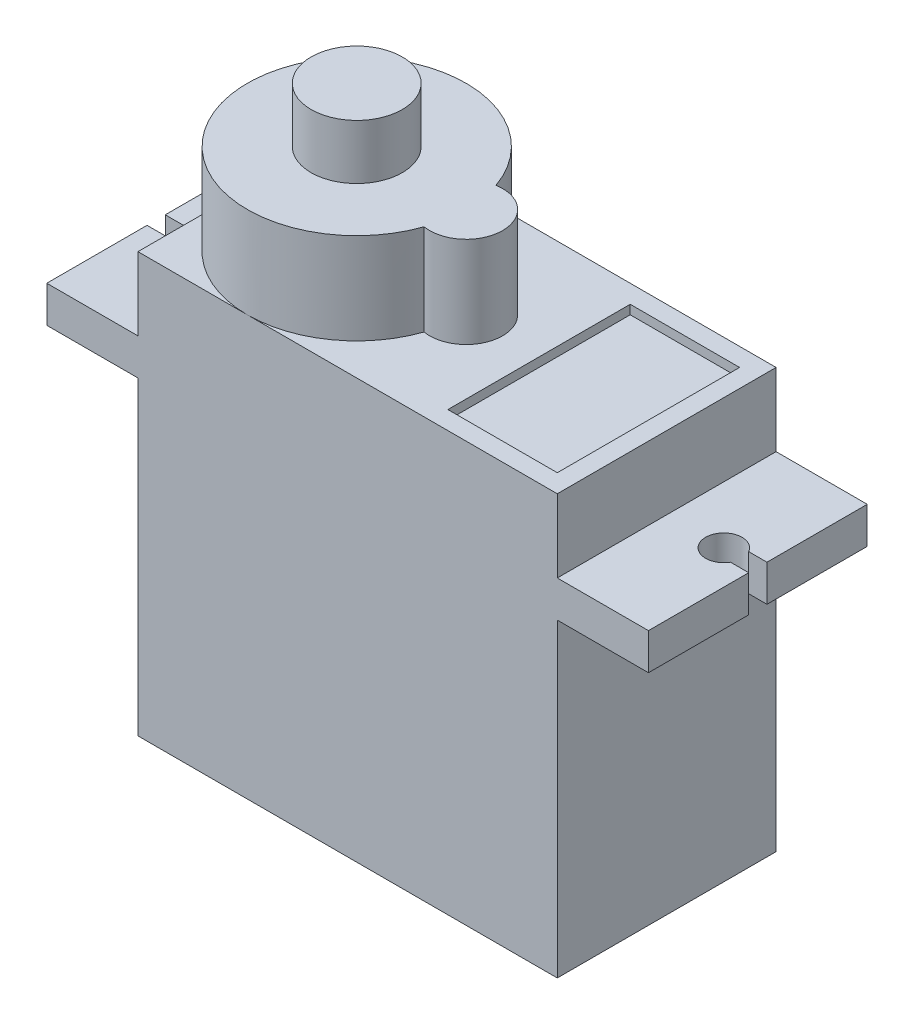
ISO-10303-21;
HEADER;
FILE_DESCRIPTION(('STEP AP214'),'2;1');
FILE_NAME('part.step','',(''),(''),'','','');
FILE_SCHEMA(('AUTOMOTIVE_DESIGN { 1 0 10303 214 1 1 1 1 }'));
ENDSEC;
DATA;
#1=APPLICATION_CONTEXT('core data for automotive mechanical design processes');
#2=APPLICATION_PROTOCOL_DEFINITION('international standard','automotive_design',2000,#1);
#3=PRODUCT_CONTEXT('',#1,'mechanical');
#4=PRODUCT('Part','Part','',(#3));
#5=PRODUCT_RELATED_PRODUCT_CATEGORY('part','',(#4));
#6=PRODUCT_DEFINITION_FORMATION('','',#4);
#7=PRODUCT_DEFINITION_CONTEXT('part definition',#1,'design');
#8=PRODUCT_DEFINITION('design','',#6,#7);
#9=PRODUCT_DEFINITION_SHAPE('','',#8);
#10=(LENGTH_UNIT() NAMED_UNIT(*) SI_UNIT(.MILLI.,.METRE.));
#11=(NAMED_UNIT(*) PLANE_ANGLE_UNIT() SI_UNIT($,.RADIAN.));
#12=(NAMED_UNIT(*) SI_UNIT($,.STERADIAN.) SOLID_ANGLE_UNIT());
#13=UNCERTAINTY_MEASURE_WITH_UNIT(LENGTH_MEASURE(1.E-05),#10,'distance_accuracy_value','');
#14=(GEOMETRIC_REPRESENTATION_CONTEXT(3) GLOBAL_UNCERTAINTY_ASSIGNED_CONTEXT((#13)) GLOBAL_UNIT_ASSIGNED_CONTEXT((#10,
#11,#12)) REPRESENTATION_CONTEXT('',''));
#15=CARTESIAN_POINT('',(0.,0.,0.));
#16=DIRECTION('',(0.,0.,1.));
#17=DIRECTION('',(1.,0.,0.));
#18=AXIS2_PLACEMENT_3D('',#15,#16,#17);
#19=CARTESIAN_POINT('',(-5.,0.,0.));
#20=DIRECTION('',(-1.,0.,0.));
#21=DIRECTION('',(0.,0.,-1.));
#22=AXIS2_PLACEMENT_3D('',#19,#20,#21);
#23=PLANE('',#22);
#24=DIRECTION('',(0.,1.,0.));
#25=VECTOR('',#24,1.);
#26=CARTESIAN_POINT('',(-5.,0.,-5.5));
#27=LINE('',#26,#25);
#28=CARTESIAN_POINT('',(-5.,17.,-5.5));
#29=VERTEX_POINT('',#28);
#30=CARTESIAN_POINT('',(-5.,19.,-5.5));
#31=VERTEX_POINT('',#30);
#32=EDGE_CURVE('E46',#29,#31,#27,.T.);
#33=ORIENTED_EDGE('',*,*,#32,.F.);
#34=DIRECTION('',(0.,0.,-1.));
#35=VECTOR('',#34,1.);
#36=CARTESIAN_POINT('',(-5.,17.,0.));
#37=LINE('',#36,#35);
#38=CARTESIAN_POINT('',(-5.,17.,0.));
#39=VERTEX_POINT('',#38);
#40=EDGE_CURVE('E346',#39,#29,#37,.T.);
#41=ORIENTED_EDGE('',*,*,#40,.F.);
#42=DIRECTION('',(0.,-1.,0.));
#43=VECTOR('',#42,1.);
#44=CARTESIAN_POINT('',(-5.,19.,0.));
#45=LINE('',#44,#43);
#46=CARTESIAN_POINT('',(-5.,19.,0.));
#47=VERTEX_POINT('',#46);
#48=EDGE_CURVE('E334',#47,#39,#45,.T.);
#49=ORIENTED_EDGE('',*,*,#48,.F.);
#50=DIRECTION('',(0.,0.,1.));
#51=VECTOR('',#50,1.);
#52=CARTESIAN_POINT('',(-5.,19.,0.));
#53=LINE('',#52,#51);
#54=EDGE_CURVE('E337',#31,#47,#53,.T.);
#55=ORIENTED_EDGE('',*,*,#54,.F.);
#56=EDGE_LOOP('',(#33,#41,#49,#55));
#57=FACE_BOUND('',#56,.T.);
#58=ADVANCED_FACE('F38',(#57),#23,.T.);
#59=CARTESIAN_POINT('',(0.,23.,0.));
#60=DIRECTION('',(1.,0.,0.));
#61=DIRECTION('',(0.,0.,-1.));
#62=AXIS2_PLACEMENT_3D('',#59,#60,#61);
#63=PLANE('',#62);
#64=DIRECTION('',(0.,-1.,0.));
#65=VECTOR('',#64,1.);
#66=CARTESIAN_POINT('',(0.,23.,-12.));
#67=LINE('',#66,#65);
#68=CARTESIAN_POINT('',(0.,23.,-12.));
#69=VERTEX_POINT('',#68);
#70=CARTESIAN_POINT('',(0.,19.,-12.));
#71=VERTEX_POINT('',#70);
#72=EDGE_CURVE('E457',#69,#71,#67,.T.);
#73=ORIENTED_EDGE('',*,*,#72,.T.);
#74=DIRECTION('',(0.,0.,1.));
#75=VECTOR('',#74,1.);
#76=CARTESIAN_POINT('',(0.,19.,0.));
#77=LINE('',#76,#75);
#78=CARTESIAN_POINT('',(0.,19.,0.));
#79=VERTEX_POINT('',#78);
#80=EDGE_CURVE('E333',#71,#79,#77,.T.);
#81=ORIENTED_EDGE('',*,*,#80,.T.);
#82=DIRECTION('',(0.,-1.,0.));
#83=VECTOR('',#82,1.);
#84=CARTESIAN_POINT('',(0.,23.,0.));
#85=LINE('',#84,#83);
#86=CARTESIAN_POINT('',(0.,23.,0.));
#87=VERTEX_POINT('',#86);
#88=EDGE_CURVE('E467',#87,#79,#85,.T.);
#89=ORIENTED_EDGE('',*,*,#88,.F.);
#90=DIRECTION('',(0.,0.,1.));
#91=VECTOR('',#90,1.);
#92=CARTESIAN_POINT('',(0.,23.,0.));
#93=LINE('',#92,#91);
#94=CARTESIAN_POINT('',(0.,23.,-6.));
#95=VERTEX_POINT('',#94);
#96=EDGE_CURVE('E435',#95,#87,#93,.T.);
#97=ORIENTED_EDGE('',*,*,#96,.F.);
#98=EDGE_CURVE('E431',#69,#95,#93,.T.);
#99=ORIENTED_EDGE('',*,*,#98,.F.);
#100=EDGE_LOOP('',(#73,#81,#89,#97,#99));
#101=FACE_BOUND('',#100,.T.);
#102=ADVANCED_FACE('F502',(#101),#63,.F.);
#103=CARTESIAN_POINT('',(28.,17.,0.));
#104=DIRECTION('',(0.,1.,0.));
#105=DIRECTION('',(0.,0.,1.));
#106=AXIS2_PLACEMENT_3D('',#103,#104,#105);
#107=PLANE('',#106);
#108=DIRECTION('',(1.,0.,0.));
#109=VECTOR('',#108,1.);
#110=CARTESIAN_POINT('',(28.,17.,-6.5));
#111=LINE('',#110,#109);
#112=CARTESIAN_POINT('',(27.,17.,-6.5));
#113=VERTEX_POINT('',#112);
#114=CARTESIAN_POINT('',(28.,17.,-6.5));
#115=VERTEX_POINT('',#114);
#116=EDGE_CURVE('E376',#113,#115,#111,.T.);
#117=ORIENTED_EDGE('',*,*,#116,.F.);
#118=CARTESIAN_POINT('',(26.1339745962156,17.,-6.));
#119=DIRECTION('',(0.,1.,0.));
#120=DIRECTION('',(0.,0.,1.));
#121=AXIS2_PLACEMENT_3D('',#118,#119,#120);
#122=CIRCLE('',#121,1.);
#123=CARTESIAN_POINT('',(27.,17.,-5.5));
#124=VERTEX_POINT('',#123);
#125=EDGE_CURVE('E378',#124,#113,#122,.F.);
#126=ORIENTED_EDGE('',*,*,#125,.F.);
#127=DIRECTION('',(-1.,0.,0.));
#128=VECTOR('',#127,1.);
#129=CARTESIAN_POINT('',(28.,17.,-5.5));
#130=LINE('',#129,#128);
#131=CARTESIAN_POINT('',(28.,17.,-5.5));
#132=VERTEX_POINT('',#131);
#133=EDGE_CURVE('E372',#132,#124,#130,.T.);
#134=ORIENTED_EDGE('',*,*,#133,.F.);
#135=DIRECTION('',(0.,0.,-1.));
#136=VECTOR('',#135,1.);
#137=CARTESIAN_POINT('',(28.,17.,0.));
#138=LINE('',#137,#136);
#139=CARTESIAN_POINT('',(28.,17.,0.));
#140=VERTEX_POINT('',#139);
#141=EDGE_CURVE('E386',#140,#132,#138,.T.);
#142=ORIENTED_EDGE('',*,*,#141,.F.);
#143=DIRECTION('',(-1.,0.,0.));
#144=VECTOR('',#143,1.);
#145=CARTESIAN_POINT('',(28.,17.,0.));
#146=LINE('',#145,#144);
#147=CARTESIAN_POINT('',(23.,17.,0.));
#148=VERTEX_POINT('',#147);
#149=EDGE_CURVE('E408',#140,#148,#146,.T.);
#150=ORIENTED_EDGE('',*,*,#149,.T.);
#151=DIRECTION('',(0.,0.,-1.));
#152=VECTOR('',#151,1.);
#153=CARTESIAN_POINT('',(23.,17.,0.));
#154=LINE('',#153,#152);
#155=CARTESIAN_POINT('',(23.,17.,-12.));
#156=VERTEX_POINT('',#155);
#157=EDGE_CURVE('E380',#148,#156,#154,.T.);
#158=ORIENTED_EDGE('',*,*,#157,.T.);
#159=DIRECTION('',(-1.,0.,0.));
#160=VECTOR('',#159,1.);
#161=CARTESIAN_POINT('',(28.,17.,-12.));
#162=LINE('',#161,#160);
#163=CARTESIAN_POINT('',(28.,17.,-12.));
#164=VERTEX_POINT('',#163);
#165=EDGE_CURVE('E405',#164,#156,#162,.T.);
#166=ORIENTED_EDGE('',*,*,#165,.F.);
#167=EDGE_CURVE('E384',#115,#164,#138,.T.);
#168=ORIENTED_EDGE('',*,*,#167,.F.);
#169=EDGE_LOOP('',(#117,#126,#134,#142,#150,#158,#166,#168));
#170=FACE_BOUND('',#169,.T.);
#171=ADVANCED_FACE('F538',(#170),#107,.F.);
#172=CARTESIAN_POINT('',(28.,19.,0.));
#173=DIRECTION('',(0.,-1.,0.));
#174=DIRECTION('',(0.,0.,-1.));
#175=AXIS2_PLACEMENT_3D('',#172,#173,#174);
#176=PLANE('',#175);
#177=DIRECTION('',(-1.,0.,0.));
#178=VECTOR('',#177,1.);
#179=CARTESIAN_POINT('',(28.,19.,-6.5));
#180=LINE('',#179,#178);
#181=CARTESIAN_POINT('',(28.,19.,-6.5));
#182=VERTEX_POINT('',#181);
#183=CARTESIAN_POINT('',(27.,19.,-6.5));
#184=VERTEX_POINT('',#183);
#185=EDGE_CURVE('E374',#182,#184,#180,.T.);
#186=ORIENTED_EDGE('',*,*,#185,.F.);
#187=DIRECTION('',(0.,0.,1.));
#188=VECTOR('',#187,1.);
#189=CARTESIAN_POINT('',(28.,19.,0.));
#190=LINE('',#189,#188);
#191=CARTESIAN_POINT('',(28.,19.,-12.));
#192=VERTEX_POINT('',#191);
#193=EDGE_CURVE('E392',#192,#182,#190,.T.);
#194=ORIENTED_EDGE('',*,*,#193,.F.);
#195=DIRECTION('',(-1.,0.,0.));
#196=VECTOR('',#195,1.);
#197=CARTESIAN_POINT('',(28.,19.,-12.));
#198=LINE('',#197,#196);
#199=CARTESIAN_POINT('',(23.,19.,-12.));
#200=VERTEX_POINT('',#199);
#201=EDGE_CURVE('E402',#192,#200,#198,.T.);
#202=ORIENTED_EDGE('',*,*,#201,.T.);
#203=DIRECTION('',(0.,0.,1.));
#204=VECTOR('',#203,1.);
#205=CARTESIAN_POINT('',(23.,19.,0.));
#206=LINE('',#205,#204);
#207=CARTESIAN_POINT('',(23.,19.,0.));
#208=VERTEX_POINT('',#207);
#209=EDGE_CURVE('E385',#200,#208,#206,.T.);
#210=ORIENTED_EDGE('',*,*,#209,.T.);
#211=DIRECTION('',(-1.,0.,0.));
#212=VECTOR('',#211,1.);
#213=CARTESIAN_POINT('',(28.,19.,0.));
#214=LINE('',#213,#212);
#215=CARTESIAN_POINT('',(28.,19.,0.));
#216=VERTEX_POINT('',#215);
#217=EDGE_CURVE('E395',#216,#208,#214,.T.);
#218=ORIENTED_EDGE('',*,*,#217,.F.);
#219=CARTESIAN_POINT('',(28.,19.,-5.5));
#220=VERTEX_POINT('',#219);
#221=EDGE_CURVE('E391',#220,#216,#190,.T.);
#222=ORIENTED_EDGE('',*,*,#221,.F.);
#223=DIRECTION('',(1.,0.,0.));
#224=VECTOR('',#223,1.);
#225=CARTESIAN_POINT('',(28.,19.,-5.5));
#226=LINE('',#225,#224);
#227=CARTESIAN_POINT('',(27.,19.,-5.5));
#228=VERTEX_POINT('',#227);
#229=EDGE_CURVE('E370',#228,#220,#226,.T.);
#230=ORIENTED_EDGE('',*,*,#229,.F.);
#231=CARTESIAN_POINT('',(26.1339745962156,19.,-6.));
#232=DIRECTION('',(0.,-1.,0.));
#233=DIRECTION('',(0.,0.,-1.));
#234=AXIS2_PLACEMENT_3D('',#231,#232,#233);
#235=CIRCLE('',#234,1.);
#236=EDGE_CURVE('E476',#184,#228,#235,.F.);
#237=ORIENTED_EDGE('',*,*,#236,.F.);
#238=EDGE_LOOP('',(#186,#194,#202,#210,#218,#222,#230,#237));
#239=FACE_BOUND('',#238,.T.);
#240=ADVANCED_FACE('F551',(#239),#176,.F.);
#241=CARTESIAN_POINT('',(28.,0.,0.));
#242=DIRECTION('',(1.,0.,0.));
#243=DIRECTION('',(0.,0.,-1.));
#244=AXIS2_PLACEMENT_3D('',#241,#242,#243);
#245=PLANE('',#244);
#246=ORIENTED_EDGE('',*,*,#193,.T.);
#247=DIRECTION('',(0.,-1.,0.));
#248=VECTOR('',#247,1.);
#249=CARTESIAN_POINT('',(28.,0.,-6.5));
#250=LINE('',#249,#248);
#251=EDGE_CURVE('E473',#182,#115,#250,.T.);
#252=ORIENTED_EDGE('',*,*,#251,.T.);
#253=ORIENTED_EDGE('',*,*,#167,.T.);
#254=DIRECTION('',(0.,1.,0.));
#255=VECTOR('',#254,1.);
#256=CARTESIAN_POINT('',(28.,19.,-12.));
#257=LINE('',#256,#255);
#258=EDGE_CURVE('E389',#164,#192,#257,.T.);
#259=ORIENTED_EDGE('',*,*,#258,.T.);
#260=EDGE_LOOP('',(#246,#252,#253,#259));
#261=FACE_BOUND('',#260,.T.);
#262=ADVANCED_FACE('F618',(#261),#245,.T.);
#263=ORIENTED_EDGE('',*,*,#141,.T.);
#264=DIRECTION('',(0.,1.,0.));
#265=VECTOR('',#264,1.);
#266=CARTESIAN_POINT('',(28.,0.,-5.5));
#267=LINE('',#266,#265);
#268=EDGE_CURVE('E470',#132,#220,#267,.T.);
#269=ORIENTED_EDGE('',*,*,#268,.T.);
#270=ORIENTED_EDGE('',*,*,#221,.T.);
#271=DIRECTION('',(0.,-1.,0.));
#272=VECTOR('',#271,1.);
#273=CARTESIAN_POINT('',(28.,19.,0.));
#274=LINE('',#273,#272);
#275=EDGE_CURVE('E381',#216,#140,#274,.T.);
#276=ORIENTED_EDGE('',*,*,#275,.T.);
#277=EDGE_LOOP('',(#263,#269,#270,#276));
#278=FACE_BOUND('',#277,.T.);
#279=ADVANCED_FACE('F543',(#278),#245,.T.);
#280=CARTESIAN_POINT('',(23.,23.,0.));
#281=DIRECTION('',(-1.,0.,0.));
#282=DIRECTION('',(0.,0.,1.));
#283=AXIS2_PLACEMENT_3D('',#280,#281,#282);
#284=PLANE('',#283);
#285=ORIENTED_EDGE('',*,*,#209,.F.);
#286=DIRECTION('',(0.,-1.,0.));
#287=VECTOR('',#286,1.);
#288=CARTESIAN_POINT('',(23.,23.,-12.));
#289=LINE('',#288,#287);
#290=CARTESIAN_POINT('',(23.,23.,-12.));
#291=VERTEX_POINT('',#290);
#292=EDGE_CURVE('E460',#291,#200,#289,.T.);
#293=ORIENTED_EDGE('',*,*,#292,.F.);
#294=DIRECTION('',(0.,0.,-1.));
#295=VECTOR('',#294,1.);
#296=CARTESIAN_POINT('',(23.,23.,0.));
#297=LINE('',#296,#295);
#298=CARTESIAN_POINT('',(23.,23.,0.));
#299=VERTEX_POINT('',#298);
#300=EDGE_CURVE('E439',#299,#291,#297,.T.);
#301=ORIENTED_EDGE('',*,*,#300,.F.);
#302=DIRECTION('',(0.,-1.,0.));
#303=VECTOR('',#302,1.);
#304=CARTESIAN_POINT('',(23.,23.,0.));
#305=LINE('',#304,#303);
#306=EDGE_CURVE('E464',#299,#208,#305,.T.);
#307=ORIENTED_EDGE('',*,*,#306,.T.);
#308=EDGE_LOOP('',(#285,#293,#301,#307));
#309=FACE_BOUND('',#308,.T.);
#310=ADVANCED_FACE('F557',(#309),#284,.F.);
#311=ORIENTED_EDGE('',*,*,#157,.F.);
#312=CARTESIAN_POINT('',(23.,0.,0.));
#313=VERTEX_POINT('',#312);
#314=EDGE_CURVE('E463',#148,#313,#305,.T.);
#315=ORIENTED_EDGE('',*,*,#314,.T.);
#316=DIRECTION('',(0.,0.,-1.));
#317=VECTOR('',#316,1.);
#318=CARTESIAN_POINT('',(23.,0.,0.));
#319=LINE('',#318,#317);
#320=CARTESIAN_POINT('',(23.,0.,-12.));
#321=VERTEX_POINT('',#320);
#322=EDGE_CURVE('E451',#313,#321,#319,.T.);
#323=ORIENTED_EDGE('',*,*,#322,.T.);
#324=EDGE_CURVE('E459',#156,#321,#289,.T.);
#325=ORIENTED_EDGE('',*,*,#324,.F.);
#326=EDGE_LOOP('',(#311,#315,#323,#325));
#327=FACE_BOUND('',#326,.T.);
#328=ADVANCED_FACE('F533',(#327),#284,.F.);
#329=CARTESIAN_POINT('',(0.,23.,0.));
#330=DIRECTION('',(0.,-1.,0.));
#331=DIRECTION('',(0.,0.,-1.));
#332=AXIS2_PLACEMENT_3D('',#329,#330,#331);
#333=PLANE('',#332);
#334=DIRECTION('',(1.,0.,0.));
#335=VECTOR('',#334,1.);
#336=CARTESIAN_POINT('',(16.,23.,-1.));
#337=LINE('',#336,#335);
#338=CARTESIAN_POINT('',(16.,23.,-1.));
#339=VERTEX_POINT('',#338);
#340=CARTESIAN_POINT('',(22.,23.,-1.));
#341=VERTEX_POINT('',#340);
#342=EDGE_CURVE('E296',#339,#341,#337,.T.);
#343=ORIENTED_EDGE('',*,*,#342,.F.);
#344=DIRECTION('',(0.,0.,1.));
#345=VECTOR('',#344,1.);
#346=CARTESIAN_POINT('',(16.,23.,-11.));
#347=LINE('',#346,#345);
#348=CARTESIAN_POINT('',(16.,23.,-11.));
#349=VERTEX_POINT('',#348);
#350=EDGE_CURVE('E61',#349,#339,#347,.T.);
#351=ORIENTED_EDGE('',*,*,#350,.F.);
#352=DIRECTION('',(-1.,0.,0.));
#353=VECTOR('',#352,1.);
#354=CARTESIAN_POINT('',(16.,23.,-11.));
#355=LINE('',#354,#353);
#356=CARTESIAN_POINT('',(22.,23.,-11.));
#357=VERTEX_POINT('',#356);
#358=EDGE_CURVE('E285',#357,#349,#355,.T.);
#359=ORIENTED_EDGE('',*,*,#358,.F.);
#360=DIRECTION('',(0.,0.,-1.));
#361=VECTOR('',#360,1.);
#362=CARTESIAN_POINT('',(22.,23.,-11.));
#363=LINE('',#362,#361);
#364=EDGE_CURVE('E299',#341,#357,#363,.T.);
#365=ORIENTED_EDGE('',*,*,#364,.F.);
#366=EDGE_LOOP('',(#343,#351,#359,#365));
#367=FACE_BOUND('',#366,.T.);
#368=CARTESIAN_POINT('',(12.,23.,-6.));
#369=DIRECTION('',(0.,1.,0.));
#370=DIRECTION('',(0.,0.,1.));
#371=AXIS2_PLACEMENT_3D('',#368,#369,#370);
#372=CIRCLE('',#371,2.);
#373=CARTESIAN_POINT('',(11.6666666666667,23.,-4.02797340563346));
#374=VERTEX_POINT('',#373);
#375=CARTESIAN_POINT('',(11.6666666666667,23.,-7.97202659436654));
#376=VERTEX_POINT('',#375);
#377=EDGE_CURVE('E411',#374,#376,#372,.T.);
#378=ORIENTED_EDGE('',*,*,#377,.F.);
#379=CARTESIAN_POINT('',(6.,23.,-6.));
#380=DIRECTION('',(0.,1.,0.));
#381=DIRECTION('',(0.,0.,1.));
#382=AXIS2_PLACEMENT_3D('',#379,#380,#381);
#383=CIRCLE('',#382,6.);
#384=CARTESIAN_POINT('',(6.,23.,0.));
#385=VERTEX_POINT('',#384);
#386=EDGE_CURVE('E424',#385,#374,#383,.T.);
#387=ORIENTED_EDGE('',*,*,#386,.F.);
#388=DIRECTION('',(1.,0.,0.));
#389=VECTOR('',#388,1.);
#390=CARTESIAN_POINT('',(0.,23.,0.));
#391=LINE('',#390,#389);
#392=EDGE_CURVE('E434',#385,#299,#391,.T.);
#393=ORIENTED_EDGE('',*,*,#392,.T.);
#394=ORIENTED_EDGE('',*,*,#300,.T.);
#395=DIRECTION('',(-1.,0.,0.));
#396=VECTOR('',#395,1.);
#397=CARTESIAN_POINT('',(0.,23.,-12.));
#398=LINE('',#397,#396);
#399=CARTESIAN_POINT('',(6.,23.,-12.));
#400=VERTEX_POINT('',#399);
#401=EDGE_CURVE('E442',#291,#400,#398,.T.);
#402=ORIENTED_EDGE('',*,*,#401,.T.);
#403=EDGE_CURVE('E416',#376,#400,#383,.T.);
#404=ORIENTED_EDGE('',*,*,#403,.F.);
#405=EDGE_LOOP('',(#378,#387,#393,#394,#402,#404));
#406=FACE_BOUND('',#405,.T.);
#407=ADVANCED_FACE('F561',(#367,#406),#333,.F.);
#408=EDGE_CURVE('E423',#400,#95,#383,.T.);
#409=ORIENTED_EDGE('',*,*,#408,.F.);
#410=EDGE_CURVE('E441',#400,#69,#398,.T.);
#411=ORIENTED_EDGE('',*,*,#410,.T.);
#412=ORIENTED_EDGE('',*,*,#98,.T.);
#413=EDGE_LOOP('',(#409,#411,#412));
#414=FACE_BOUND('',#413,.T.);
#415=ADVANCED_FACE('F576',(#414),#333,.F.);
#416=DIRECTION('',(0.,0.,1.));
#417=VECTOR('',#416,1.);
#418=CARTESIAN_POINT('',(0.,5.,-7.5));
#419=LINE('',#418,#417);
#420=CARTESIAN_POINT('',(0.,5.,-7.5));
#421=VERTEX_POINT('',#420);
#422=CARTESIAN_POINT('',(0.,5.,-4.5));
#423=VERTEX_POINT('',#422);
#424=EDGE_CURVE('E272',#421,#423,#419,.T.);
#425=ORIENTED_EDGE('',*,*,#424,.F.);
#426=DIRECTION('',(0.,-1.,0.));
#427=VECTOR('',#426,1.);
#428=CARTESIAN_POINT('',(0.,6.,-7.5));
#429=LINE('',#428,#427);
#430=CARTESIAN_POINT('',(0.,6.,-7.5));
#431=VERTEX_POINT('',#430);
#432=EDGE_CURVE('E53',#431,#421,#429,.T.);
#433=ORIENTED_EDGE('',*,*,#432,.F.);
#434=DIRECTION('',(0.,0.,-1.));
#435=VECTOR('',#434,1.);
#436=CARTESIAN_POINT('',(0.,6.,-7.5));
#437=LINE('',#436,#435);
#438=CARTESIAN_POINT('',(0.,6.,-4.5));
#439=VERTEX_POINT('',#438);
#440=EDGE_CURVE('E263',#439,#431,#437,.T.);
#441=ORIENTED_EDGE('',*,*,#440,.F.);
#442=DIRECTION('',(0.,1.,0.));
#443=VECTOR('',#442,1.);
#444=CARTESIAN_POINT('',(0.,6.,-4.5));
#445=LINE('',#444,#443);
#446=EDGE_CURVE('E266',#423,#439,#445,.T.);
#447=ORIENTED_EDGE('',*,*,#446,.F.);
#448=EDGE_LOOP('',(#425,#433,#441,#447));
#449=FACE_BOUND('',#448,.T.);
#450=CARTESIAN_POINT('',(0.,17.,0.));
#451=VERTEX_POINT('',#450);
#452=CARTESIAN_POINT('',(0.,0.,0.));
#453=VERTEX_POINT('',#452);
#454=EDGE_CURVE('E466',#451,#453,#85,.T.);
#455=ORIENTED_EDGE('',*,*,#454,.F.);
#456=DIRECTION('',(0.,0.,-1.));
#457=VECTOR('',#456,1.);
#458=CARTESIAN_POINT('',(0.,17.,0.));
#459=LINE('',#458,#457);
#460=CARTESIAN_POINT('',(0.,17.,-12.));
#461=VERTEX_POINT('',#460);
#462=EDGE_CURVE('E338',#451,#461,#459,.T.);
#463=ORIENTED_EDGE('',*,*,#462,.T.);
#464=CARTESIAN_POINT('',(0.,0.,-12.));
#465=VERTEX_POINT('',#464);
#466=EDGE_CURVE('E445',#461,#465,#67,.T.);
#467=ORIENTED_EDGE('',*,*,#466,.T.);
#468=DIRECTION('',(0.,0.,1.));
#469=VECTOR('',#468,1.);
#470=CARTESIAN_POINT('',(0.,0.,0.));
#471=LINE('',#470,#469);
#472=EDGE_CURVE('E430',#465,#453,#471,.T.);
#473=ORIENTED_EDGE('',*,*,#472,.T.);
#474=EDGE_LOOP('',(#455,#463,#467,#473));
#475=FACE_BOUND('',#474,.T.);
#476=ADVANCED_FACE('F40',(#449,#475),#63,.F.);
#477=CARTESIAN_POINT('',(0.,23.,0.));
#478=DIRECTION('',(0.,0.,-1.));
#479=DIRECTION('',(-1.,0.,0.));
#480=AXIS2_PLACEMENT_3D('',#477,#478,#479);
#481=PLANE('',#480);
#482=DIRECTION('',(1.,0.,0.));
#483=VECTOR('',#482,1.);
#484=CARTESIAN_POINT('',(0.,0.,0.));
#485=LINE('',#484,#483);
#486=EDGE_CURVE('E448',#453,#313,#485,.T.);
#487=ORIENTED_EDGE('',*,*,#486,.T.);
#488=ORIENTED_EDGE('',*,*,#314,.F.);
#489=ORIENTED_EDGE('',*,*,#149,.F.);
#490=ORIENTED_EDGE('',*,*,#275,.F.);
#491=ORIENTED_EDGE('',*,*,#217,.T.);
#492=ORIENTED_EDGE('',*,*,#306,.F.);
#493=ORIENTED_EDGE('',*,*,#392,.F.);
#494=EDGE_CURVE('E436',#87,#385,#391,.T.);
#495=ORIENTED_EDGE('',*,*,#494,.F.);
#496=ORIENTED_EDGE('',*,*,#88,.T.);
#497=DIRECTION('',(1.,0.,0.));
#498=VECTOR('',#497,1.);
#499=CARTESIAN_POINT('',(-5.,19.,0.));
#500=LINE('',#499,#498);
#501=EDGE_CURVE('E361',#47,#79,#500,.T.);
#502=ORIENTED_EDGE('',*,*,#501,.F.);
#503=ORIENTED_EDGE('',*,*,#48,.T.);
#504=DIRECTION('',(1.,0.,0.));
#505=VECTOR('',#504,1.);
#506=CARTESIAN_POINT('',(-5.,17.,0.));
#507=LINE('',#506,#505);
#508=EDGE_CURVE('E349',#39,#451,#507,.T.);
#509=ORIENTED_EDGE('',*,*,#508,.T.);
#510=ORIENTED_EDGE('',*,*,#454,.T.);
#511=EDGE_LOOP('',(#487,#488,#489,#490,#491,#492,#493,#495,#496,#502,#503,#509,#510));
#512=FACE_BOUND('',#511,.T.);
#513=ADVANCED_FACE('F495',(#512),#481,.F.);
#514=CARTESIAN_POINT('',(0.,23.,-12.));
#515=DIRECTION('',(0.,0.,1.));
#516=DIRECTION('',(1.,0.,0.));
#517=AXIS2_PLACEMENT_3D('',#514,#515,#516);
#518=PLANE('',#517);
#519=DIRECTION('',(-1.,0.,0.));
#520=VECTOR('',#519,1.);
#521=CARTESIAN_POINT('',(0.,0.,-12.));
#522=LINE('',#521,#520);
#523=EDGE_CURVE('E454',#321,#465,#522,.T.);
#524=ORIENTED_EDGE('',*,*,#523,.T.);
#525=ORIENTED_EDGE('',*,*,#466,.F.);
#526=DIRECTION('',(1.,0.,0.));
#527=VECTOR('',#526,1.);
#528=CARTESIAN_POINT('',(-5.,17.,-12.));
#529=LINE('',#528,#527);
#530=CARTESIAN_POINT('',(-5.,17.,-12.));
#531=VERTEX_POINT('',#530);
#532=EDGE_CURVE('E355',#531,#461,#529,.T.);
#533=ORIENTED_EDGE('',*,*,#532,.F.);
#534=DIRECTION('',(0.,1.,0.));
#535=VECTOR('',#534,1.);
#536=CARTESIAN_POINT('',(-5.,19.,-12.));
#537=LINE('',#536,#535);
#538=CARTESIAN_POINT('',(-5.,19.,-12.));
#539=VERTEX_POINT('',#538);
#540=EDGE_CURVE('E342',#531,#539,#537,.T.);
#541=ORIENTED_EDGE('',*,*,#540,.T.);
#542=DIRECTION('',(1.,0.,0.));
#543=VECTOR('',#542,1.);
#544=CARTESIAN_POINT('',(-5.,19.,-12.));
#545=LINE('',#544,#543);
#546=EDGE_CURVE('E358',#539,#71,#545,.T.);
#547=ORIENTED_EDGE('',*,*,#546,.T.);
#548=ORIENTED_EDGE('',*,*,#72,.F.);
#549=ORIENTED_EDGE('',*,*,#410,.F.);
#550=ORIENTED_EDGE('',*,*,#401,.F.);
#551=ORIENTED_EDGE('',*,*,#292,.T.);
#552=ORIENTED_EDGE('',*,*,#201,.F.);
#553=ORIENTED_EDGE('',*,*,#258,.F.);
#554=ORIENTED_EDGE('',*,*,#165,.T.);
#555=ORIENTED_EDGE('',*,*,#324,.T.);
#556=EDGE_LOOP('',(#524,#525,#533,#541,#547,#548,#549,#550,#551,#552,#553,#554,#555));
#557=FACE_BOUND('',#556,.T.);
#558=ADVANCED_FACE('F508',(#557),#518,.F.);
#559=EDGE_CURVE('E572',#95,#385,#383,.T.);
#560=ORIENTED_EDGE('',*,*,#559,.F.);
#561=ORIENTED_EDGE('',*,*,#96,.T.);
#562=ORIENTED_EDGE('',*,*,#494,.T.);
#563=EDGE_LOOP('',(#560,#561,#562));
#564=FACE_BOUND('',#563,.T.);
#565=ADVANCED_FACE('F574',(#564),#333,.F.);
#566=CARTESIAN_POINT('',(0.,0.,0.));
#567=DIRECTION('',(0.,-1.,0.));
#568=DIRECTION('',(0.,0.,-1.));
#569=AXIS2_PLACEMENT_3D('',#566,#567,#568);
#570=PLANE('',#569);
#571=ORIENTED_EDGE('',*,*,#472,.F.);
#572=ORIENTED_EDGE('',*,*,#523,.F.);
#573=ORIENTED_EDGE('',*,*,#322,.F.);
#574=ORIENTED_EDGE('',*,*,#486,.F.);
#575=EDGE_LOOP('',(#571,#572,#573,#574));
#576=FACE_BOUND('',#575,.T.);
#577=ADVANCED_FACE('F530',(#576),#570,.T.);
#578=CARTESIAN_POINT('',(12.,28.,-6.));
#579=DIRECTION('',(0.,-1.,0.));
#580=DIRECTION('',(0.,0.,-1.));
#581=AXIS2_PLACEMENT_3D('',#578,#579,#580);
#582=CYLINDRICAL_SURFACE('',#581,2.);
#583=ORIENTED_EDGE('',*,*,#377,.T.);
#584=DIRECTION('',(0.,-1.,0.));
#585=VECTOR('',#584,1.);
#586=CARTESIAN_POINT('',(11.6666666666667,28.,-7.97202659436654));
#587=LINE('',#586,#585);
#588=CARTESIAN_POINT('',(11.6666666666667,28.,-7.97202659436654));
#589=VERTEX_POINT('',#588);
#590=EDGE_CURVE('E427',#589,#376,#587,.T.);
#591=ORIENTED_EDGE('',*,*,#590,.F.);
#592=CARTESIAN_POINT('',(12.,28.,-6.));
#593=DIRECTION('',(0.,1.,0.));
#594=DIRECTION('',(0.,0.,1.));
#595=AXIS2_PLACEMENT_3D('',#592,#593,#594);
#596=CIRCLE('',#595,2.);
#597=CARTESIAN_POINT('',(11.6666666666667,28.,-4.02797340563346));
#598=VERTEX_POINT('',#597);
#599=EDGE_CURVE('E412',#598,#589,#596,.T.);
#600=ORIENTED_EDGE('',*,*,#599,.F.);
#601=DIRECTION('',(0.,-1.,0.));
#602=VECTOR('',#601,1.);
#603=CARTESIAN_POINT('',(11.6666666666667,28.,-4.02797340563346));
#604=LINE('',#603,#602);
#605=EDGE_CURVE('E418',#598,#374,#604,.T.);
#606=ORIENTED_EDGE('',*,*,#605,.T.);
#607=EDGE_LOOP('',(#583,#591,#600,#606));
#608=FACE_BOUND('',#607,.T.);
#609=ADVANCED_FACE('F570',(#608),#582,.T.);
#610=CARTESIAN_POINT('',(6.,28.,-6.));
#611=DIRECTION('',(0.,-1.,0.));
#612=DIRECTION('',(0.,0.,-1.));
#613=AXIS2_PLACEMENT_3D('',#610,#611,#612);
#614=CYLINDRICAL_SURFACE('',#613,6.);
#615=ORIENTED_EDGE('',*,*,#403,.T.);
#616=ORIENTED_EDGE('',*,*,#408,.T.);
#617=ORIENTED_EDGE('',*,*,#559,.T.);
#618=ORIENTED_EDGE('',*,*,#386,.T.);
#619=ORIENTED_EDGE('',*,*,#605,.F.);
#620=CARTESIAN_POINT('',(6.,28.,-6.));
#621=DIRECTION('',(0.,1.,0.));
#622=DIRECTION('',(0.,0.,1.));
#623=AXIS2_PLACEMENT_3D('',#620,#621,#622);
#624=CIRCLE('',#623,6.);
#625=EDGE_CURVE('E415',#589,#598,#624,.T.);
#626=ORIENTED_EDGE('',*,*,#625,.F.);
#627=ORIENTED_EDGE('',*,*,#590,.T.);
#628=EDGE_LOOP('',(#615,#616,#617,#618,#619,#626,#627));
#629=FACE_BOUND('',#628,.T.);
#630=ADVANCED_FACE('F564',(#629),#614,.T.);
#631=CARTESIAN_POINT('',(9.,28.,-6.));
#632=DIRECTION('',(0.,1.,0.));
#633=DIRECTION('',(0.,0.,1.));
#634=AXIS2_PLACEMENT_3D('',#631,#632,#633);
#635=PLANE('',#634);
#636=CARTESIAN_POINT('',(6.,28.,-6.));
#637=DIRECTION('',(0.,1.,0.));
#638=DIRECTION('',(0.,0.,1.));
#639=AXIS2_PLACEMENT_3D('',#636,#637,#638);
#640=CIRCLE('',#639,2.5);
#641=CARTESIAN_POINT('',(6.,28.,-3.5));
#642=VERTEX_POINT('',#641);
#643=EDGE_CURVE('E306',#642,#642,#640,.T.);
#644=ORIENTED_EDGE('',*,*,#643,.F.);
#645=EDGE_LOOP('',(#644));
#646=FACE_BOUND('',#645,.T.);
#647=ORIENTED_EDGE('',*,*,#599,.T.);
#648=ORIENTED_EDGE('',*,*,#625,.T.);
#649=EDGE_LOOP('',(#647,#648));
#650=FACE_BOUND('',#649,.T.);
#651=ADVANCED_FACE('F613',(#646,#650),#635,.T.);
#652=CARTESIAN_POINT('',(26.1339745962156,28.,-6.));
#653=DIRECTION('',(0.,-1.,0.));
#654=DIRECTION('',(0.,0.,-1.));
#655=AXIS2_PLACEMENT_3D('',#652,#653,#654);
#656=CYLINDRICAL_SURFACE('',#655,1.);
#657=ORIENTED_EDGE('',*,*,#125,.T.);
#658=DIRECTION('',(0.,-1.,0.));
#659=VECTOR('',#658,1.);
#660=CARTESIAN_POINT('',(27.,28.,-6.5));
#661=LINE('',#660,#659);
#662=EDGE_CURVE('E367',#184,#113,#661,.T.);
#663=ORIENTED_EDGE('',*,*,#662,.F.);
#664=ORIENTED_EDGE('',*,*,#236,.T.);
#665=DIRECTION('',(0.,-1.,0.));
#666=VECTOR('',#665,1.);
#667=CARTESIAN_POINT('',(27.,28.,-5.5));
#668=LINE('',#667,#666);
#669=EDGE_CURVE('E364',#228,#124,#668,.T.);
#670=ORIENTED_EDGE('',*,*,#669,.T.);
#671=EDGE_LOOP('',(#657,#663,#664,#670));
#672=FACE_BOUND('',#671,.T.);
#673=ADVANCED_FACE('F610',(#672),#656,.F.);
#674=CARTESIAN_POINT('',(28.,28.,-6.5));
#675=DIRECTION('',(0.,0.,1.));
#676=DIRECTION('',(1.,0.,0.));
#677=AXIS2_PLACEMENT_3D('',#674,#675,#676);
#678=PLANE('',#677);
#679=ORIENTED_EDGE('',*,*,#116,.T.);
#680=ORIENTED_EDGE('',*,*,#251,.F.);
#681=ORIENTED_EDGE('',*,*,#185,.T.);
#682=ORIENTED_EDGE('',*,*,#662,.T.);
#683=EDGE_LOOP('',(#679,#680,#681,#682));
#684=FACE_BOUND('',#683,.T.);
#685=ADVANCED_FACE('F608',(#684),#678,.T.);
#686=CARTESIAN_POINT('',(28.,28.,-5.5));
#687=DIRECTION('',(0.,0.,-1.));
#688=DIRECTION('',(-1.,0.,0.));
#689=AXIS2_PLACEMENT_3D('',#686,#687,#688);
#690=PLANE('',#689);
#691=ORIENTED_EDGE('',*,*,#133,.T.);
#692=ORIENTED_EDGE('',*,*,#669,.F.);
#693=ORIENTED_EDGE('',*,*,#229,.T.);
#694=ORIENTED_EDGE('',*,*,#268,.F.);
#695=EDGE_LOOP('',(#691,#692,#693,#694));
#696=FACE_BOUND('',#695,.T.);
#697=ADVANCED_FACE('F603',(#696),#690,.T.);
#698=CARTESIAN_POINT('',(-5.,19.,0.));
#699=DIRECTION('',(0.,1.,0.));
#700=DIRECTION('',(0.,0.,1.));
#701=AXIS2_PLACEMENT_3D('',#698,#699,#700);
#702=PLANE('',#701);
#703=DIRECTION('',(1.,0.,0.));
#704=VECTOR('',#703,1.);
#705=CARTESIAN_POINT('',(-5.,19.,-5.5));
#706=LINE('',#705,#704);
#707=CARTESIAN_POINT('',(-4.,19.,-5.5));
#708=VERTEX_POINT('',#707);
#709=EDGE_CURVE('E329',#31,#708,#706,.T.);
#710=ORIENTED_EDGE('',*,*,#709,.F.);
#711=ORIENTED_EDGE('',*,*,#54,.T.);
#712=ORIENTED_EDGE('',*,*,#501,.T.);
#713=ORIENTED_EDGE('',*,*,#80,.F.);
#714=ORIENTED_EDGE('',*,*,#546,.F.);
#715=CARTESIAN_POINT('',(-5.,19.,-6.5));
#716=VERTEX_POINT('',#715);
#717=EDGE_CURVE('E339',#539,#716,#53,.T.);
#718=ORIENTED_EDGE('',*,*,#717,.T.);
#719=DIRECTION('',(-1.,0.,0.));
#720=VECTOR('',#719,1.);
#721=CARTESIAN_POINT('',(-5.,19.,-6.5));
#722=LINE('',#721,#720);
#723=CARTESIAN_POINT('',(-4.,19.,-6.5));
#724=VERTEX_POINT('',#723);
#725=EDGE_CURVE('E325',#724,#716,#722,.T.);
#726=ORIENTED_EDGE('',*,*,#725,.F.);
#727=CARTESIAN_POINT('',(-3.13397459621556,19.,-6.));
#728=DIRECTION('',(0.,1.,0.));
#729=DIRECTION('',(0.,0.,1.));
#730=AXIS2_PLACEMENT_3D('',#727,#728,#729);
#731=CIRCLE('',#730,1.);
#732=EDGE_CURVE('E331',#708,#724,#731,.T.);
#733=ORIENTED_EDGE('',*,*,#732,.F.);
#734=EDGE_LOOP('',(#710,#711,#712,#713,#714,#718,#726,#733));
#735=FACE_BOUND('',#734,.T.);
#736=ADVANCED_FACE('F490',(#735),#702,.T.);
#737=CARTESIAN_POINT('',(-5.,17.,0.));
#738=DIRECTION('',(0.,-1.,0.));
#739=DIRECTION('',(0.,0.,-1.));
#740=AXIS2_PLACEMENT_3D('',#737,#738,#739);
#741=PLANE('',#740);
#742=DIRECTION('',(-1.,0.,0.));
#743=VECTOR('',#742,1.);
#744=CARTESIAN_POINT('',(-5.,17.,-5.5));
#745=LINE('',#744,#743);
#746=CARTESIAN_POINT('',(-4.,17.,-5.5));
#747=VERTEX_POINT('',#746);
#748=EDGE_CURVE('E327',#747,#29,#745,.T.);
#749=ORIENTED_EDGE('',*,*,#748,.F.);
#750=CARTESIAN_POINT('',(-3.13397459621556,17.,-6.));
#751=DIRECTION('',(0.,-1.,0.));
#752=DIRECTION('',(0.,0.,-1.));
#753=AXIS2_PLACEMENT_3D('',#750,#751,#752);
#754=CIRCLE('',#753,1.);
#755=CARTESIAN_POINT('',(-4.,17.,-6.5));
#756=VERTEX_POINT('',#755);
#757=EDGE_CURVE('E11',#756,#747,#754,.T.);
#758=ORIENTED_EDGE('',*,*,#757,.F.);
#759=DIRECTION('',(1.,0.,0.));
#760=VECTOR('',#759,1.);
#761=CARTESIAN_POINT('',(-5.,17.,-6.5));
#762=LINE('',#761,#760);
#763=CARTESIAN_POINT('',(-5.,17.,-6.5));
#764=VERTEX_POINT('',#763);
#765=EDGE_CURVE('E323',#764,#756,#762,.T.);
#766=ORIENTED_EDGE('',*,*,#765,.F.);
#767=EDGE_CURVE('E345',#764,#531,#37,.T.);
#768=ORIENTED_EDGE('',*,*,#767,.T.);
#769=ORIENTED_EDGE('',*,*,#532,.T.);
#770=ORIENTED_EDGE('',*,*,#462,.F.);
#771=ORIENTED_EDGE('',*,*,#508,.F.);
#772=ORIENTED_EDGE('',*,*,#40,.T.);
#773=EDGE_LOOP('',(#749,#758,#766,#768,#769,#770,#771,#772));
#774=FACE_BOUND('',#773,.T.);
#775=ADVANCED_FACE('F523',(#774),#741,.T.);
#776=DIRECTION('',(0.,-1.,0.));
#777=VECTOR('',#776,1.);
#778=CARTESIAN_POINT('',(-5.,0.,-6.5));
#779=LINE('',#778,#777);
#780=EDGE_CURVE('E478',#716,#764,#779,.T.);
#781=ORIENTED_EDGE('',*,*,#780,.F.);
#782=ORIENTED_EDGE('',*,*,#717,.F.);
#783=ORIENTED_EDGE('',*,*,#540,.F.);
#784=ORIENTED_EDGE('',*,*,#767,.F.);
#785=EDGE_LOOP('',(#781,#782,#783,#784));
#786=FACE_BOUND('',#785,.T.);
#787=ADVANCED_FACE('F514',(#786),#23,.T.);
#788=CARTESIAN_POINT('',(-5.,28.,-5.5));
#789=DIRECTION('',(0.,0.,1.));
#790=DIRECTION('',(1.,0.,0.));
#791=AXIS2_PLACEMENT_3D('',#788,#789,#790);
#792=PLANE('',#791);
#793=ORIENTED_EDGE('',*,*,#709,.T.);
#794=DIRECTION('',(0.,-1.,0.));
#795=VECTOR('',#794,1.);
#796=CARTESIAN_POINT('',(-4.,28.,-5.5));
#797=LINE('',#796,#795);
#798=EDGE_CURVE('E320',#708,#747,#797,.T.);
#799=ORIENTED_EDGE('',*,*,#798,.T.);
#800=ORIENTED_EDGE('',*,*,#748,.T.);
#801=ORIENTED_EDGE('',*,*,#32,.T.);
#802=EDGE_LOOP('',(#793,#799,#800,#801));
#803=FACE_BOUND('',#802,.T.);
#804=ADVANCED_FACE('F482',(#803),#792,.F.);
#805=CARTESIAN_POINT('',(-3.13397459621556,28.,-6.));
#806=DIRECTION('',(0.,-1.,0.));
#807=DIRECTION('',(0.,0.,-1.));
#808=AXIS2_PLACEMENT_3D('',#805,#806,#807);
#809=CYLINDRICAL_SURFACE('',#808,1.);
#810=ORIENTED_EDGE('',*,*,#732,.T.);
#811=DIRECTION('',(0.,-1.,0.));
#812=VECTOR('',#811,1.);
#813=CARTESIAN_POINT('',(-4.,28.,-6.5));
#814=LINE('',#813,#812);
#815=EDGE_CURVE('E315',#724,#756,#814,.T.);
#816=ORIENTED_EDGE('',*,*,#815,.T.);
#817=ORIENTED_EDGE('',*,*,#757,.T.);
#818=ORIENTED_EDGE('',*,*,#798,.F.);
#819=EDGE_LOOP('',(#810,#816,#817,#818));
#820=FACE_BOUND('',#819,.T.);
#821=ADVANCED_FACE('F521',(#820),#809,.F.);
#822=CARTESIAN_POINT('',(-5.,28.,-6.5));
#823=DIRECTION('',(0.,0.,-1.));
#824=DIRECTION('',(-1.,0.,0.));
#825=AXIS2_PLACEMENT_3D('',#822,#823,#824);
#826=PLANE('',#825);
#827=ORIENTED_EDGE('',*,*,#725,.T.);
#828=ORIENTED_EDGE('',*,*,#780,.T.);
#829=ORIENTED_EDGE('',*,*,#765,.T.);
#830=ORIENTED_EDGE('',*,*,#815,.F.);
#831=EDGE_LOOP('',(#827,#828,#829,#830));
#832=FACE_BOUND('',#831,.T.);
#833=ADVANCED_FACE('F517',(#832),#826,.F.);
#834=CARTESIAN_POINT('',(6.,31.,-6.));
#835=DIRECTION('',(0.,-1.,0.));
#836=DIRECTION('',(0.,0.,-1.));
#837=AXIS2_PLACEMENT_3D('',#834,#835,#836);
#838=CYLINDRICAL_SURFACE('',#837,2.5);
#839=CARTESIAN_POINT('',(6.,31.,-6.));
#840=DIRECTION('',(0.,1.,0.));
#841=DIRECTION('',(0.,0.,1.));
#842=AXIS2_PLACEMENT_3D('',#839,#840,#841);
#843=CIRCLE('',#842,2.5);
#844=CARTESIAN_POINT('',(6.,31.,-3.5));
#845=VERTEX_POINT('',#844);
#846=EDGE_CURVE('E312',#845,#845,#843,.T.);
#847=ORIENTED_EDGE('',*,*,#846,.F.);
#848=EDGE_LOOP('',(#847));
#849=FACE_BOUND('',#848,.T.);
#850=ORIENTED_EDGE('',*,*,#643,.T.);
#851=EDGE_LOOP('',(#850));
#852=FACE_BOUND('',#851,.T.);
#853=ADVANCED_FACE('F782',(#849,#852),#838,.T.);
#854=CARTESIAN_POINT('',(6.,31.,-6.));
#855=DIRECTION('',(0.,1.,0.));
#856=DIRECTION('',(0.,0.,1.));
#857=AXIS2_PLACEMENT_3D('',#854,#855,#856);
#858=PLANE('',#857);
#859=ORIENTED_EDGE('',*,*,#846,.T.);
#860=EDGE_LOOP('',(#859));
#861=FACE_BOUND('',#860,.T.);
#862=ADVANCED_FACE('F797',(#861),#858,.T.);
#863=CARTESIAN_POINT('',(16.,22.5,-11.));
#864=DIRECTION('',(-1.,0.,0.));
#865=DIRECTION('',(0.,0.,1.));
#866=AXIS2_PLACEMENT_3D('',#863,#864,#865);
#867=PLANE('',#866);
#868=ORIENTED_EDGE('',*,*,#350,.T.);
#869=DIRECTION('',(0.,1.,0.));
#870=VECTOR('',#869,1.);
#871=CARTESIAN_POINT('',(16.,22.5,-1.));
#872=LINE('',#871,#870);
#873=CARTESIAN_POINT('',(16.,22.5,-1.));
#874=VERTEX_POINT('',#873);
#875=EDGE_CURVE('E294',#874,#339,#872,.T.);
#876=ORIENTED_EDGE('',*,*,#875,.F.);
#877=DIRECTION('',(0.,0.,1.));
#878=VECTOR('',#877,1.);
#879=CARTESIAN_POINT('',(16.,22.5,-11.));
#880=LINE('',#879,#878);
#881=CARTESIAN_POINT('',(16.,22.5,-11.));
#882=VERTEX_POINT('',#881);
#883=EDGE_CURVE('E281',#882,#874,#880,.T.);
#884=ORIENTED_EDGE('',*,*,#883,.F.);
#885=DIRECTION('',(0.,1.,0.));
#886=VECTOR('',#885,1.);
#887=CARTESIAN_POINT('',(16.,22.5,-11.));
#888=LINE('',#887,#886);
#889=EDGE_CURVE('E304',#882,#349,#888,.T.);
#890=ORIENTED_EDGE('',*,*,#889,.T.);
#891=EDGE_LOOP('',(#868,#876,#884,#890));
#892=FACE_BOUND('',#891,.T.);
#893=ADVANCED_FACE('F808',(#892),#867,.F.);
#894=CARTESIAN_POINT('',(16.,22.5,-11.));
#895=DIRECTION('',(0.,0.,-1.));
#896=DIRECTION('',(-1.,0.,0.));
#897=AXIS2_PLACEMENT_3D('',#894,#895,#896);
#898=PLANE('',#897);
#899=ORIENTED_EDGE('',*,*,#358,.T.);
#900=ORIENTED_EDGE('',*,*,#889,.F.);
#901=DIRECTION('',(-1.,0.,0.));
#902=VECTOR('',#901,1.);
#903=CARTESIAN_POINT('',(16.,22.5,-11.));
#904=LINE('',#903,#902);
#905=CARTESIAN_POINT('',(22.,22.5,-11.));
#906=VERTEX_POINT('',#905);
#907=EDGE_CURVE('E291',#906,#882,#904,.T.);
#908=ORIENTED_EDGE('',*,*,#907,.F.);
#909=DIRECTION('',(0.,1.,0.));
#910=VECTOR('',#909,1.);
#911=CARTESIAN_POINT('',(22.,22.5,-11.));
#912=LINE('',#911,#910);
#913=EDGE_CURVE('E307',#906,#357,#912,.T.);
#914=ORIENTED_EDGE('',*,*,#913,.T.);
#915=EDGE_LOOP('',(#899,#900,#908,#914));
#916=FACE_BOUND('',#915,.T.);
#917=ADVANCED_FACE('F823',(#916),#898,.F.);
#918=CARTESIAN_POINT('',(22.,22.5,-11.));
#919=DIRECTION('',(1.,0.,0.));
#920=DIRECTION('',(0.,0.,-1.));
#921=AXIS2_PLACEMENT_3D('',#918,#919,#920);
#922=PLANE('',#921);
#923=ORIENTED_EDGE('',*,*,#364,.T.);
#924=ORIENTED_EDGE('',*,*,#913,.F.);
#925=DIRECTION('',(0.,0.,-1.));
#926=VECTOR('',#925,1.);
#927=CARTESIAN_POINT('',(22.,22.5,-11.));
#928=LINE('',#927,#926);
#929=CARTESIAN_POINT('',(22.,22.5,-1.));
#930=VERTEX_POINT('',#929);
#931=EDGE_CURVE('E288',#930,#906,#928,.T.);
#932=ORIENTED_EDGE('',*,*,#931,.F.);
#933=DIRECTION('',(0.,1.,0.));
#934=VECTOR('',#933,1.);
#935=CARTESIAN_POINT('',(22.,22.5,-1.));
#936=LINE('',#935,#934);
#937=EDGE_CURVE('E309',#930,#341,#936,.T.);
#938=ORIENTED_EDGE('',*,*,#937,.T.);
#939=EDGE_LOOP('',(#923,#924,#932,#938));
#940=FACE_BOUND('',#939,.T.);
#941=ADVANCED_FACE('F832',(#940),#922,.F.);
#942=CARTESIAN_POINT('',(16.,22.5,-1.));
#943=DIRECTION('',(0.,0.,1.));
#944=DIRECTION('',(1.,0.,0.));
#945=AXIS2_PLACEMENT_3D('',#942,#943,#944);
#946=PLANE('',#945);
#947=ORIENTED_EDGE('',*,*,#342,.T.);
#948=ORIENTED_EDGE('',*,*,#937,.F.);
#949=DIRECTION('',(1.,0.,0.));
#950=VECTOR('',#949,1.);
#951=CARTESIAN_POINT('',(16.,22.5,-1.));
#952=LINE('',#951,#950);
#953=EDGE_CURVE('E284',#874,#930,#952,.T.);
#954=ORIENTED_EDGE('',*,*,#953,.F.);
#955=ORIENTED_EDGE('',*,*,#875,.T.);
#956=EDGE_LOOP('',(#947,#948,#954,#955));
#957=FACE_BOUND('',#956,.T.);
#958=ADVANCED_FACE('F842',(#957),#946,.F.);
#959=CARTESIAN_POINT('',(0.,22.5,0.));
#960=DIRECTION('',(0.,1.,0.));
#961=DIRECTION('',(0.,0.,1.));
#962=AXIS2_PLACEMENT_3D('',#959,#960,#961);
#963=PLANE('',#962);
#964=ORIENTED_EDGE('',*,*,#883,.T.);
#965=ORIENTED_EDGE('',*,*,#953,.T.);
#966=ORIENTED_EDGE('',*,*,#931,.T.);
#967=ORIENTED_EDGE('',*,*,#907,.T.);
#968=EDGE_LOOP('',(#964,#965,#966,#967));
#969=FACE_BOUND('',#968,.T.);
#970=ADVANCED_FACE('F852',(#969),#963,.T.);
#971=CARTESIAN_POINT('',(1.,6.,-7.5));
#972=DIRECTION('',(0.,0.,-1.));
#973=DIRECTION('',(-1.,0.,0.));
#974=AXIS2_PLACEMENT_3D('',#971,#972,#973);
#975=PLANE('',#974);
#976=ORIENTED_EDGE('',*,*,#432,.T.);
#977=DIRECTION('',(-1.,0.,0.));
#978=VECTOR('',#977,1.);
#979=CARTESIAN_POINT('',(1.,5.,-7.5));
#980=LINE('',#979,#978);
#981=CARTESIAN_POINT('',(1.,5.,-7.5));
#982=VERTEX_POINT('',#981);
#983=EDGE_CURVE('E241',#982,#421,#980,.T.);
#984=ORIENTED_EDGE('',*,*,#983,.F.);
#985=DIRECTION('',(0.,-1.,0.));
#986=VECTOR('',#985,1.);
#987=CARTESIAN_POINT('',(1.,6.,-7.5));
#988=LINE('',#987,#986);
#989=CARTESIAN_POINT('',(1.,6.,-7.5));
#990=VERTEX_POINT('',#989);
#991=EDGE_CURVE('E245',#990,#982,#988,.T.);
#992=ORIENTED_EDGE('',*,*,#991,.F.);
#993=DIRECTION('',(-1.,0.,0.));
#994=VECTOR('',#993,1.);
#995=CARTESIAN_POINT('',(1.,6.,-7.5));
#996=LINE('',#995,#994);
#997=EDGE_CURVE('E276',#990,#431,#996,.T.);
#998=ORIENTED_EDGE('',*,*,#997,.T.);
#999=EDGE_LOOP('',(#976,#984,#992,#998));
#1000=FACE_BOUND('',#999,.T.);
#1001=ADVANCED_FACE('F243',(#1000),#975,.F.);
#1002=CARTESIAN_POINT('',(1.,6.,-7.5));
#1003=DIRECTION('',(0.,1.,0.));
#1004=DIRECTION('',(0.,0.,1.));
#1005=AXIS2_PLACEMENT_3D('',#1002,#1003,#1004);
#1006=PLANE('',#1005);
#1007=ORIENTED_EDGE('',*,*,#440,.T.);
#1008=ORIENTED_EDGE('',*,*,#997,.F.);
#1009=DIRECTION('',(0.,0.,-1.));
#1010=VECTOR('',#1009,1.);
#1011=CARTESIAN_POINT('',(1.,6.,-7.5));
#1012=LINE('',#1011,#1010);
#1013=CARTESIAN_POINT('',(1.,6.,-4.5));
#1014=VERTEX_POINT('',#1013);
#1015=EDGE_CURVE('E251',#1014,#990,#1012,.T.);
#1016=ORIENTED_EDGE('',*,*,#1015,.F.);
#1017=DIRECTION('',(-1.,0.,0.));
#1018=VECTOR('',#1017,1.);
#1019=CARTESIAN_POINT('',(1.,6.,-4.5));
#1020=LINE('',#1019,#1018);
#1021=EDGE_CURVE('E278',#1014,#439,#1020,.T.);
#1022=ORIENTED_EDGE('',*,*,#1021,.T.);
#1023=EDGE_LOOP('',(#1007,#1008,#1016,#1022));
#1024=FACE_BOUND('',#1023,.T.);
#1025=ADVANCED_FACE('F875',(#1024),#1006,.F.);
#1026=CARTESIAN_POINT('',(1.,6.,-4.5));
#1027=DIRECTION('',(0.,0.,1.));
#1028=DIRECTION('',(1.,0.,0.));
#1029=AXIS2_PLACEMENT_3D('',#1026,#1027,#1028);
#1030=PLANE('',#1029);
#1031=ORIENTED_EDGE('',*,*,#446,.T.);
#1032=ORIENTED_EDGE('',*,*,#1021,.F.);
#1033=DIRECTION('',(0.,1.,0.));
#1034=VECTOR('',#1033,1.);
#1035=CARTESIAN_POINT('',(1.,6.,-4.5));
#1036=LINE('',#1035,#1034);
#1037=CARTESIAN_POINT('',(1.,5.,-4.5));
#1038=VERTEX_POINT('',#1037);
#1039=EDGE_CURVE('E259',#1038,#1014,#1036,.T.);
#1040=ORIENTED_EDGE('',*,*,#1039,.F.);
#1041=DIRECTION('',(-1.,0.,0.));
#1042=VECTOR('',#1041,1.);
#1043=CARTESIAN_POINT('',(1.,5.,-4.5));
#1044=LINE('',#1043,#1042);
#1045=EDGE_CURVE('E250',#1038,#423,#1044,.T.);
#1046=ORIENTED_EDGE('',*,*,#1045,.T.);
#1047=EDGE_LOOP('',(#1031,#1032,#1040,#1046));
#1048=FACE_BOUND('',#1047,.T.);
#1049=ADVANCED_FACE('F884',(#1048),#1030,.F.);
#1050=CARTESIAN_POINT('',(1.,5.,-7.5));
#1051=DIRECTION('',(0.,-1.,0.));
#1052=DIRECTION('',(0.,0.,-1.));
#1053=AXIS2_PLACEMENT_3D('',#1050,#1051,#1052);
#1054=PLANE('',#1053);
#1055=ORIENTED_EDGE('',*,*,#424,.T.);
#1056=ORIENTED_EDGE('',*,*,#1045,.F.);
#1057=DIRECTION('',(0.,0.,1.));
#1058=VECTOR('',#1057,1.);
#1059=CARTESIAN_POINT('',(1.,5.,-7.5));
#1060=LINE('',#1059,#1058);
#1061=EDGE_CURVE('E254',#982,#1038,#1060,.T.);
#1062=ORIENTED_EDGE('',*,*,#1061,.F.);
#1063=ORIENTED_EDGE('',*,*,#983,.T.);
#1064=EDGE_LOOP('',(#1055,#1056,#1062,#1063));
#1065=FACE_BOUND('',#1064,.T.);
#1066=ADVANCED_FACE('F255',(#1065),#1054,.F.);
#1067=CARTESIAN_POINT('',(1.,0.,0.));
#1068=DIRECTION('',(-1.,0.,0.));
#1069=DIRECTION('',(0.,0.,1.));
#1070=AXIS2_PLACEMENT_3D('',#1067,#1068,#1069);
#1071=PLANE('',#1070);
#1072=ORIENTED_EDGE('',*,*,#991,.T.);
#1073=ORIENTED_EDGE('',*,*,#1061,.T.);
#1074=ORIENTED_EDGE('',*,*,#1039,.T.);
#1075=ORIENTED_EDGE('',*,*,#1015,.T.);
#1076=EDGE_LOOP('',(#1072,#1073,#1074,#1075));
#1077=FACE_BOUND('',#1076,.T.);
#1078=ADVANCED_FACE('F261',(#1077),#1071,.T.);
#1079=CLOSED_SHELL('',(#58,#102,#171,#240,#262,#279,#310,#328,#407,#415,#476,#513,#558,#565,
#577,#609,#630,#651,#673,#685,#697,#736,#775,#787,#804,#821,#833,#853,#862,#893,#917,#941,#958,
#970,#1001,#1025,#1049,#1066,#1078));
#1080=MANIFOLD_SOLID_BREP('B2',#1079);
#1081=ADVANCED_BREP_SHAPE_REPRESENTATION('',(#18,#1080),#14);
#1082=SHAPE_DEFINITION_REPRESENTATION(#9,#1081);
ENDSEC;
END-ISO-10303-21;
